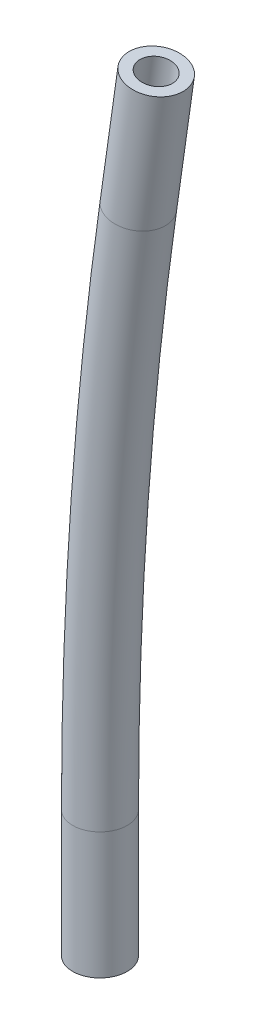
ISO-10303-21;
HEADER;
FILE_DESCRIPTION(('STEP AP214'),'2;1');
FILE_NAME('part.step','',(''),(''),'','','');
FILE_SCHEMA(('AUTOMOTIVE_DESIGN { 1 0 10303 214 1 1 1 1 }'));
ENDSEC;
DATA;
#1=APPLICATION_CONTEXT('core data for automotive mechanical design processes');
#2=APPLICATION_PROTOCOL_DEFINITION('international standard','automotive_design',2000,#1);
#3=PRODUCT_CONTEXT('',#1,'mechanical');
#4=PRODUCT('Part','Part','',(#3));
#5=PRODUCT_RELATED_PRODUCT_CATEGORY('part','',(#4));
#6=PRODUCT_DEFINITION_FORMATION('','',#4);
#7=PRODUCT_DEFINITION_CONTEXT('part definition',#1,'design');
#8=PRODUCT_DEFINITION('design','',#6,#7);
#9=PRODUCT_DEFINITION_SHAPE('','',#8);
#10=(LENGTH_UNIT() NAMED_UNIT(*) SI_UNIT(.MILLI.,.METRE.));
#11=(NAMED_UNIT(*) PLANE_ANGLE_UNIT() SI_UNIT($,.RADIAN.));
#12=(NAMED_UNIT(*) SI_UNIT($,.STERADIAN.) SOLID_ANGLE_UNIT());
#13=UNCERTAINTY_MEASURE_WITH_UNIT(LENGTH_MEASURE(1.E-05),#10,'distance_accuracy_value','');
#14=(GEOMETRIC_REPRESENTATION_CONTEXT(3) GLOBAL_UNCERTAINTY_ASSIGNED_CONTEXT((#13)) GLOBAL_UNIT_ASSIGNED_CONTEXT((#10,
#11,#12)) REPRESENTATION_CONTEXT('',''));
#15=CARTESIAN_POINT('',(0.,0.,0.));
#16=DIRECTION('',(0.,0.,1.));
#17=DIRECTION('',(1.,0.,0.));
#18=AXIS2_PLACEMENT_3D('',#15,#16,#17);
#19=CARTESIAN_POINT('',(0.,0.,0.));
#20=DIRECTION('',(0.,1.,0.));
#21=DIRECTION('',(0.,0.,1.));
#22=AXIS2_PLACEMENT_3D('',#19,#20,#21);
#23=CYLINDRICAL_SURFACE('',#22,3.175);
#24=CARTESIAN_POINT('',(0.,14.732,0.));
#25=DIRECTION('',(0.,1.,0.));
#26=DIRECTION('',(0.,0.,1.));
#27=AXIS2_PLACEMENT_3D('',#24,#25,#26);
#28=CIRCLE('',#27,3.175);
#29=CARTESIAN_POINT('',(-3.17499999999998,14.732,0.));
#30=VERTEX_POINT('',#29);
#31=EDGE_CURVE('E58',#30,#30,#28,.T.);
#32=ORIENTED_EDGE('',*,*,#31,.F.);
#33=EDGE_LOOP('',(#32));
#34=FACE_BOUND('',#33,.T.);
#35=CARTESIAN_POINT('',(0.,0.,0.));
#36=DIRECTION('',(0.,1.,0.));
#37=DIRECTION('',(0.,0.,1.));
#38=AXIS2_PLACEMENT_3D('',#35,#36,#37);
#39=CIRCLE('',#38,3.175);
#40=CARTESIAN_POINT('',(0.,0.,3.175));
#41=VERTEX_POINT('',#40);
#42=EDGE_CURVE('E56',#41,#41,#39,.T.);
#43=ORIENTED_EDGE('',*,*,#42,.T.);
#44=EDGE_LOOP('',(#43));
#45=FACE_BOUND('',#44,.T.);
#46=ADVANCED_FACE('F35',(#34,#45),#23,.T.);
#47=CARTESIAN_POINT('',(448.267590437049,14.732,0.));
#48=DIRECTION('',(0.,0.,-1.));
#49=DIRECTION('',(-1.,0.,0.));
#50=AXIS2_PLACEMENT_3D('',#47,#48,#49);
#51=TOROIDAL_SURFACE('',#50,448.267590437049,3.175);
#52=CARTESIAN_POINT('',(4.47207091677399,77.8934557302721,0.));
#53=DIRECTION('',(0.140901231937583,0.990023657716558,0.));
#54=DIRECTION('',(0.,0.,1.));
#55=AXIS2_PLACEMENT_3D('',#52,#53,#54);
#56=CIRCLE('',#55,3.175);
#57=CARTESIAN_POINT('',(1.32874580352393,78.3408171416739,0.));
#58=VERTEX_POINT('',#57);
#59=EDGE_CURVE('E39',#58,#58,#56,.T.);
#60=CARTESIAN_POINT('',(448.267590437049,14.732,0.));
#61=DIRECTION('',(0.,0.,-1.));
#62=DIRECTION('',(-1.,0.,0.));
#63=AXIS2_PLACEMENT_3D('',#60,#61,#62);
#64=CIRCLE('',#63,451.442590437049);
#65=EDGE_CURVE('',#30,#58,#64,.T.);
#66=ORIENTED_EDGE('',*,*,#31,.T.);
#67=ORIENTED_EDGE('',*,*,#59,.F.);
#68=ORIENTED_EDGE('',*,*,#65,.T.);
#69=ORIENTED_EDGE('',*,*,#65,.F.);
#70=EDGE_LOOP('',(#66,#68,#67,#69));
#71=FACE_BOUND('',#70,.T.);
#72=ADVANCED_FACE('F66',(#71),#51,.T.);
#73=CARTESIAN_POINT('',(4.47207091677397,77.8934557302721,0.));
#74=DIRECTION('',(0.140901231937583,0.990023657716558,0.));
#75=DIRECTION('',(-0.990023657716558,0.140901231937583,0.));
#76=AXIS2_PLACEMENT_3D('',#73,#74,#75);
#77=CYLINDRICAL_SURFACE('',#76,3.175);
#78=CARTESIAN_POINT('',(6.54782786567844,92.4784842557524,0.));
#79=DIRECTION('',(0.140901231937583,0.990023657716557,0.));
#80=DIRECTION('',(0.,0.,1.));
#81=AXIS2_PLACEMENT_3D('',#78,#79,#80);
#82=CIRCLE('',#81,3.175);
#83=CARTESIAN_POINT('',(6.54782786567844,92.4784842557524,3.175));
#84=VERTEX_POINT('',#83);
#85=EDGE_CURVE('E52',#84,#84,#82,.T.);
#86=ORIENTED_EDGE('',*,*,#85,.F.);
#87=EDGE_LOOP('',(#86));
#88=FACE_BOUND('',#87,.T.);
#89=ORIENTED_EDGE('',*,*,#59,.T.);
#90=EDGE_LOOP('',(#89));
#91=FACE_BOUND('',#90,.T.);
#92=ADVANCED_FACE('F37',(#88,#91),#77,.T.);
#93=CARTESIAN_POINT('',(0.,0.,0.));
#94=DIRECTION('',(0.,1.,0.));
#95=DIRECTION('',(0.,0.,1.));
#96=AXIS2_PLACEMENT_3D('',#93,#94,#95);
#97=PLANE('',#96);
#98=CARTESIAN_POINT('',(0.,0.,0.));
#99=DIRECTION('',(0.,1.,0.));
#100=DIRECTION('',(0.,0.,1.));
#101=AXIS2_PLACEMENT_3D('',#98,#99,#100);
#102=CIRCLE('',#101,1.905);
#103=CARTESIAN_POINT('',(0.,0.,1.905));
#104=VERTEX_POINT('',#103);
#105=EDGE_CURVE('E55',#104,#104,#102,.F.);
#106=ORIENTED_EDGE('',*,*,#105,.F.);
#107=EDGE_LOOP('',(#106));
#108=FACE_BOUND('',#107,.T.);
#109=ORIENTED_EDGE('',*,*,#42,.F.);
#110=EDGE_LOOP('',(#109));
#111=FACE_BOUND('',#110,.T.);
#112=ADVANCED_FACE('F72',(#108,#111),#97,.F.);
#113=CARTESIAN_POINT('',(6.54782786567844,92.4784842557524,0.));
#114=DIRECTION('',(0.140901231937583,0.990023657716557,0.));
#115=DIRECTION('',(0.,0.,1.));
#116=AXIS2_PLACEMENT_3D('',#113,#114,#115);
#117=PLANE('',#116);
#118=CARTESIAN_POINT('',(6.54782786567844,92.4784842557524,0.));
#119=DIRECTION('',(0.140901231937583,0.990023657716557,0.));
#120=DIRECTION('',(0.,0.,1.));
#121=AXIS2_PLACEMENT_3D('',#118,#119,#120);
#122=CIRCLE('',#121,1.905);
#123=CARTESIAN_POINT('',(6.54782786567844,92.4784842557524,1.905));
#124=VERTEX_POINT('',#123);
#125=EDGE_CURVE('E10',#124,#124,#122,.F.);
#126=ORIENTED_EDGE('',*,*,#125,.T.);
#127=EDGE_LOOP('',(#126));
#128=FACE_BOUND('',#127,.T.);
#129=ORIENTED_EDGE('',*,*,#85,.T.);
#130=EDGE_LOOP('',(#129));
#131=FACE_BOUND('',#130,.T.);
#132=ADVANCED_FACE('F90',(#128,#131),#117,.T.);
#133=CARTESIAN_POINT('',(0.,0.,0.));
#134=DIRECTION('',(0.,1.,0.));
#135=DIRECTION('',(0.,0.,1.));
#136=AXIS2_PLACEMENT_3D('',#133,#134,#135);
#137=CYLINDRICAL_SURFACE('',#136,1.905);
#138=CARTESIAN_POINT('',(0.,14.732,0.));
#139=DIRECTION('',(0.,1.,0.));
#140=DIRECTION('',(0.,0.,1.));
#141=AXIS2_PLACEMENT_3D('',#138,#139,#140);
#142=CIRCLE('',#141,1.905);
#143=CARTESIAN_POINT('',(-1.90499999999999,14.732,0.));
#144=VERTEX_POINT('',#143);
#145=EDGE_CURVE('E48',#144,#144,#142,.F.);
#146=ORIENTED_EDGE('',*,*,#145,.F.);
#147=EDGE_LOOP('',(#146));
#148=FACE_BOUND('',#147,.T.);
#149=ORIENTED_EDGE('',*,*,#105,.T.);
#150=EDGE_LOOP('',(#149));
#151=FACE_BOUND('',#150,.T.);
#152=ADVANCED_FACE('F84',(#148,#151),#137,.F.);
#153=CARTESIAN_POINT('',(448.267590437049,14.732,0.));
#154=DIRECTION('',(0.,0.,-1.));
#155=DIRECTION('',(-1.,0.,0.));
#156=AXIS2_PLACEMENT_3D('',#153,#154,#155);
#157=TOROIDAL_SURFACE('',#156,448.267590437049,1.905);
#158=CARTESIAN_POINT('',(4.47207091677399,77.8934557302721,0.));
#159=DIRECTION('',(0.140901231937583,0.990023657716558,0.));
#160=DIRECTION('',(0.,0.,1.));
#161=AXIS2_PLACEMENT_3D('',#158,#159,#160);
#162=CIRCLE('',#161,1.905);
#163=CARTESIAN_POINT('',(2.58607584882398,78.1618725771132,0.));
#164=VERTEX_POINT('',#163);
#165=EDGE_CURVE('E43',#164,#164,#162,.F.);
#166=CARTESIAN_POINT('',(448.267590437049,14.732,0.));
#167=DIRECTION('',(0.,0.,-1.));
#168=DIRECTION('',(-1.,0.,0.));
#169=AXIS2_PLACEMENT_3D('',#166,#167,#168);
#170=CIRCLE('',#169,450.172590437049);
#171=EDGE_CURVE('',#144,#164,#170,.T.);
#172=ORIENTED_EDGE('',*,*,#145,.T.);
#173=ORIENTED_EDGE('',*,*,#165,.F.);
#174=ORIENTED_EDGE('',*,*,#171,.T.);
#175=ORIENTED_EDGE('',*,*,#171,.F.);
#176=EDGE_LOOP('',(#172,#174,#173,#175));
#177=FACE_BOUND('',#176,.T.);
#178=ADVANCED_FACE('F78',(#177),#157,.F.);
#179=CARTESIAN_POINT('',(4.47207091677397,77.8934557302721,0.));
#180=DIRECTION('',(0.140901231937583,0.990023657716558,0.));
#181=DIRECTION('',(-0.990023657716558,0.140901231937583,0.));
#182=AXIS2_PLACEMENT_3D('',#179,#180,#181);
#183=CYLINDRICAL_SURFACE('',#182,1.905);
#184=ORIENTED_EDGE('',*,*,#125,.F.);
#185=EDGE_LOOP('',(#184));
#186=FACE_BOUND('',#185,.T.);
#187=ORIENTED_EDGE('',*,*,#165,.T.);
#188=EDGE_LOOP('',(#187));
#189=FACE_BOUND('',#188,.T.);
#190=ADVANCED_FACE('F76',(#186,#189),#183,.F.);
#191=CLOSED_SHELL('',(#46,#72,#92,#112,#132,#152,#178,#190));
#192=MANIFOLD_SOLID_BREP('B2',#191);
#193=ADVANCED_BREP_SHAPE_REPRESENTATION('',(#18,#192),#14);
#194=SHAPE_DEFINITION_REPRESENTATION(#9,#193);
ENDSEC;
END-ISO-10303-21;
